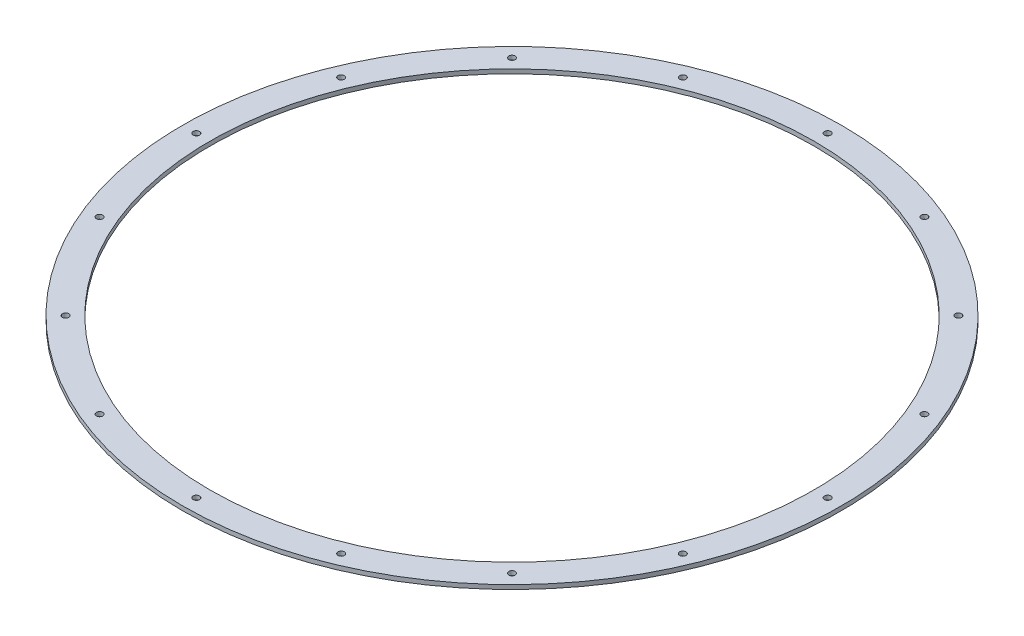
ISO-10303-21;
HEADER;
FILE_DESCRIPTION(('STEP AP214'),'2;1');
FILE_NAME('part.step','',(''),(''),'','','');
FILE_SCHEMA(('AUTOMOTIVE_DESIGN { 1 0 10303 214 1 1 1 1 }'));
ENDSEC;
DATA;
#1=APPLICATION_CONTEXT('core data for automotive mechanical design processes');
#2=APPLICATION_PROTOCOL_DEFINITION('international standard','automotive_design',2000,#1);
#3=PRODUCT_CONTEXT('',#1,'mechanical');
#4=PRODUCT('Part','Part','',(#3));
#5=PRODUCT_RELATED_PRODUCT_CATEGORY('part','',(#4));
#6=PRODUCT_DEFINITION_FORMATION('','',#4);
#7=PRODUCT_DEFINITION_CONTEXT('part definition',#1,'design');
#8=PRODUCT_DEFINITION('design','',#6,#7);
#9=PRODUCT_DEFINITION_SHAPE('','',#8);
#10=(LENGTH_UNIT() NAMED_UNIT(*) SI_UNIT(.MILLI.,.METRE.));
#11=(NAMED_UNIT(*) PLANE_ANGLE_UNIT() SI_UNIT($,.RADIAN.));
#12=(NAMED_UNIT(*) SI_UNIT($,.STERADIAN.) SOLID_ANGLE_UNIT());
#13=UNCERTAINTY_MEASURE_WITH_UNIT(LENGTH_MEASURE(1.E-05),#10,'distance_accuracy_value','');
#14=(GEOMETRIC_REPRESENTATION_CONTEXT(3) GLOBAL_UNCERTAINTY_ASSIGNED_CONTEXT((#13)) GLOBAL_UNIT_ASSIGNED_CONTEXT((#10,
#11,#12)) REPRESENTATION_CONTEXT('',''));
#15=CARTESIAN_POINT('',(0.,0.,0.));
#16=DIRECTION('',(0.,0.,1.));
#17=DIRECTION('',(1.,0.,0.));
#18=AXIS2_PLACEMENT_3D('',#15,#16,#17);
#19=CARTESIAN_POINT('',(0.,6.00000000000001,0.));
#20=DIRECTION('',(0.,1.,0.));
#21=DIRECTION('',(0.,0.,0.999999999999999));
#22=AXIS2_PLACEMENT_3D('',#19,#20,#21);
#23=PLANE('',#22);
#24=CARTESIAN_POINT('',(-312.894750675048,6.00000000000001,-312.894750675046));
#25=DIRECTION('',(0.,1.,0.));
#26=DIRECTION('',(0.707106781186548,0.,0.707106781186546));
#27=AXIS2_PLACEMENT_3D('',#24,#25,#26);
#28=CIRCLE('',#27,4.5);
#29=CARTESIAN_POINT('',(-309.712770159708,6.00000000000001,-309.712770159707));
#30=VERTEX_POINT('',#29);
#31=EDGE_CURVE('E128',#30,#30,#28,.T.);
#32=ORIENTED_EDGE('',*,*,#31,.F.);
#33=EDGE_LOOP('',(#32));
#34=FACE_BOUND('',#33,.T.);
#35=CARTESIAN_POINT('',(-408.816693136244,6.00000000000001,-169.337418821551));
#36=DIRECTION('',(0.,1.,0.));
#37=DIRECTION('',(0.923879532511287,0.,0.382683432365087));
#38=AXIS2_PLACEMENT_3D('',#35,#36,#37);
#39=CIRCLE('',#38,4.5);
#40=CARTESIAN_POINT('',(-404.659235239943,6.00000000000001,-167.615343375908));
#41=VERTEX_POINT('',#40);
#42=EDGE_CURVE('E120',#41,#41,#39,.T.);
#43=ORIENTED_EDGE('',*,*,#42,.F.);
#44=EDGE_LOOP('',(#43));
#45=FACE_BOUND('',#44,.T.);
#46=CARTESIAN_POINT('',(-442.499999999999,6.00000000000001,1.59594559789866E-12));
#47=DIRECTION('',(0.,1.,0.));
#48=DIRECTION('',(0.999999999999999,0.,0.));
#49=AXIS2_PLACEMENT_3D('',#46,#47,#48);
#50=CIRCLE('',#49,4.5);
#51=CARTESIAN_POINT('',(-437.999999999999,6.00000000000001,1.58023393187387E-12));
#52=VERTEX_POINT('',#51);
#53=EDGE_CURVE('E112',#52,#52,#50,.T.);
#54=ORIENTED_EDGE('',*,*,#53,.F.);
#55=EDGE_LOOP('',(#54));
#56=FACE_BOUND('',#55,.T.);
#57=CARTESIAN_POINT('',(-408.816693136243,6.00000000000001,169.337418821554));
#58=DIRECTION('',(0.,1.,0.));
#59=DIRECTION('',(0.923879532511285,0.,-0.382683432365094));
#60=AXIS2_PLACEMENT_3D('',#57,#58,#59);
#61=CIRCLE('',#60,4.5);
#62=CARTESIAN_POINT('',(-404.659235239942,6.00000000000001,167.615343375911));
#63=VERTEX_POINT('',#62);
#64=EDGE_CURVE('E104',#63,#63,#61,.T.);
#65=ORIENTED_EDGE('',*,*,#64,.F.);
#66=EDGE_LOOP('',(#65));
#67=FACE_BOUND('',#66,.T.);
#68=CARTESIAN_POINT('',(-312.894750675045,6.00000000000001,312.894750675049));
#69=DIRECTION('',(0.,1.,0.));
#70=DIRECTION('',(0.707106781186543,0.,-0.707106781186551));
#71=AXIS2_PLACEMENT_3D('',#68,#69,#70);
#72=CIRCLE('',#71,4.5);
#73=CARTESIAN_POINT('',(-309.712770159705,6.00000000000001,309.712770159709));
#74=VERTEX_POINT('',#73);
#75=EDGE_CURVE('E96',#74,#74,#72,.T.);
#76=ORIENTED_EDGE('',*,*,#75,.F.);
#77=EDGE_LOOP('',(#76));
#78=FACE_BOUND('',#77,.T.);
#79=CARTESIAN_POINT('',(-169.33741882155,6.00000000000001,408.816693136245));
#80=DIRECTION('',(0.,1.,0.));
#81=DIRECTION('',(0.382683432365084,0.,-0.923879532511288));
#82=AXIS2_PLACEMENT_3D('',#79,#80,#81);
#83=CIRCLE('',#82,4.5);
#84=CARTESIAN_POINT('',(-167.615343375907,6.00000000000001,404.659235239944));
#85=VERTEX_POINT('',#84);
#86=EDGE_CURVE('E88',#85,#85,#83,.T.);
#87=ORIENTED_EDGE('',*,*,#86,.F.);
#88=EDGE_LOOP('',(#87));
#89=FACE_BOUND('',#88,.T.);
#90=CARTESIAN_POINT('',(-2.22044604925031E-13,6.00000000000001,442.499999999999));
#91=DIRECTION('',(0.,1.,0.));
#92=DIRECTION('',(0.,0.,-0.999999999999999));
#93=AXIS2_PLACEMENT_3D('',#90,#91,#92);
#94=CIRCLE('',#93,4.5);
#95=CARTESIAN_POINT('',(-2.22044604925031E-13,6.00000000000001,437.999999999999));
#96=VERTEX_POINT('',#95);
#97=EDGE_CURVE('E78',#96,#96,#94,.T.);
#98=ORIENTED_EDGE('',*,*,#97,.F.);
#99=EDGE_LOOP('',(#98));
#100=FACE_BOUND('',#99,.T.);
#101=CARTESIAN_POINT('',(169.337418821555,6.00000000000001,408.816693136242));
#102=DIRECTION('',(0.,1.,0.));
#103=DIRECTION('',(-0.382683432365097,0.,-0.923879532511283));
#104=AXIS2_PLACEMENT_3D('',#101,#102,#103);
#105=CIRCLE('',#104,4.5);
#106=CARTESIAN_POINT('',(167.615343375912,6.00000000000001,404.659235239942));
#107=VERTEX_POINT('',#106);
#108=EDGE_CURVE('E79',#107,#107,#105,.T.);
#109=ORIENTED_EDGE('',*,*,#108,.F.);
#110=EDGE_LOOP('',(#109));
#111=FACE_BOUND('',#110,.T.);
#112=CARTESIAN_POINT('',(312.89475067505,6.00000000000001,312.894750675044));
#113=DIRECTION('',(0.,1.,0.));
#114=DIRECTION('',(-0.707106781186553,0.,-0.707106781186541));
#115=AXIS2_PLACEMENT_3D('',#112,#113,#114);
#116=CIRCLE('',#115,4.5);
#117=CARTESIAN_POINT('',(309.71277015971,6.00000000000001,309.712770159705));
#118=VERTEX_POINT('',#117);
#119=EDGE_CURVE('E175',#118,#118,#116,.T.);
#120=ORIENTED_EDGE('',*,*,#119,.F.);
#121=EDGE_LOOP('',(#120));
#122=FACE_BOUND('',#121,.T.);
#123=CARTESIAN_POINT('',(408.816693136246,6.00000000000001,169.337418821548));
#124=DIRECTION('',(0.,1.,0.));
#125=DIRECTION('',(-0.92387953251129,0.,-0.38268343236508));
#126=AXIS2_PLACEMENT_3D('',#123,#124,#125);
#127=CIRCLE('',#126,4.5);
#128=CARTESIAN_POINT('',(404.659235239945,6.00000000000001,167.615343375905));
#129=VERTEX_POINT('',#128);
#130=EDGE_CURVE('E167',#129,#129,#127,.T.);
#131=ORIENTED_EDGE('',*,*,#130,.F.);
#132=EDGE_LOOP('',(#131));
#133=FACE_BOUND('',#132,.T.);
#134=CARTESIAN_POINT('',(442.5,6.00000000000001,-4.69069227904129E-12));
#135=DIRECTION('',(0.,1.,0.));
#136=DIRECTION('',(-0.999999999999999,0.,0.));
#137=AXIS2_PLACEMENT_3D('',#134,#135,#136);
#138=CIRCLE('',#137,4.5);
#139=CARTESIAN_POINT('',(438.,6.00000000000001,-4.6435572809669E-12));
#140=VERTEX_POINT('',#139);
#141=EDGE_CURVE('E159',#140,#140,#138,.T.);
#142=ORIENTED_EDGE('',*,*,#141,.F.);
#143=EDGE_LOOP('',(#142));
#144=FACE_BOUND('',#143,.T.);
#145=CARTESIAN_POINT('',(408.816693136242,6.00000000000001,-169.337418821557));
#146=DIRECTION('',(0.,1.,0.));
#147=DIRECTION('',(-0.923879532511282,0.,0.382683432365099));
#148=AXIS2_PLACEMENT_3D('',#145,#146,#147);
#149=CIRCLE('',#148,4.5);
#150=CARTESIAN_POINT('',(404.659235239941,6.00000000000001,-167.615343375914));
#151=VERTEX_POINT('',#150);
#152=EDGE_CURVE('E151',#151,#151,#149,.T.);
#153=ORIENTED_EDGE('',*,*,#152,.F.);
#154=EDGE_LOOP('',(#153));
#155=FACE_BOUND('',#154,.T.);
#156=CARTESIAN_POINT('',(312.894750675043,6.00000000000001,-312.894750675051));
#157=DIRECTION('',(0.,1.,0.));
#158=DIRECTION('',(-0.707106781186538,0.,0.707106781186555));
#159=AXIS2_PLACEMENT_3D('',#156,#157,#158);
#160=CIRCLE('',#159,4.5);
#161=CARTESIAN_POINT('',(309.712770159703,6.00000000000001,-309.712770159711));
#162=VERTEX_POINT('',#161);
#163=EDGE_CURVE('E142',#162,#162,#160,.T.);
#164=ORIENTED_EDGE('',*,*,#163,.F.);
#165=EDGE_LOOP('',(#164));
#166=FACE_BOUND('',#165,.T.);
#167=CARTESIAN_POINT('',(169.337418821546,6.00000000000001,-408.816693136246));
#168=DIRECTION('',(0.,1.,0.));
#169=DIRECTION('',(-0.382683432365077,0.,0.923879532511291));
#170=AXIS2_PLACEMENT_3D('',#167,#168,#169);
#171=CIRCLE('',#170,4.5);
#172=CARTESIAN_POINT('',(167.615343375903,6.00000000000001,-404.659235239945));
#173=VERTEX_POINT('',#172);
#174=EDGE_CURVE('E143',#173,#173,#171,.T.);
#175=ORIENTED_EDGE('',*,*,#174,.F.);
#176=EDGE_LOOP('',(#175));
#177=FACE_BOUND('',#176,.T.);
#178=CARTESIAN_POINT('',(-169.337418821553,6.00000000000001,-408.816693136244));
#179=DIRECTION('',(0.,1.,0.));
#180=DIRECTION('',(0.38268343236509,0.,0.923879532511286));
#181=AXIS2_PLACEMENT_3D('',#178,#179,#180);
#182=CIRCLE('',#181,4.5);
#183=CARTESIAN_POINT('',(-167.61534337591,6.00000000000001,-404.659235239943));
#184=VERTEX_POINT('',#183);
#185=EDGE_CURVE('E69',#184,#184,#182,.T.);
#186=ORIENTED_EDGE('',*,*,#185,.F.);
#187=EDGE_LOOP('',(#186));
#188=FACE_BOUND('',#187,.T.);
#189=CARTESIAN_POINT('',(-1.11022302462516E-13,6.00000000000001,-442.499999999999));
#190=DIRECTION('',(0.,1.,0.));
#191=DIRECTION('',(0.,0.,0.999999999999999));
#192=AXIS2_PLACEMENT_3D('',#189,#190,#191);
#193=CIRCLE('',#192,4.5);
#194=CARTESIAN_POINT('',(-1.11022302462516E-13,6.00000000000001,-437.999999999999));
#195=VERTEX_POINT('',#194);
#196=EDGE_CURVE('E61',#195,#195,#193,.T.);
#197=ORIENTED_EDGE('',*,*,#196,.F.);
#198=EDGE_LOOP('',(#197));
#199=FACE_BOUND('',#198,.T.);
#200=CARTESIAN_POINT('',(0.,6.00000000000001,0.));
#201=DIRECTION('',(0.,1.,0.));
#202=DIRECTION('',(0.,0.,0.999999999999999));
#203=AXIS2_PLACEMENT_3D('',#200,#201,#202);
#204=CIRCLE('',#203,462.);
#205=CARTESIAN_POINT('',(0.,6.00000000000001,462.));
#206=VERTEX_POINT('',#205);
#207=EDGE_CURVE('E10',#206,#206,#204,.T.);
#208=ORIENTED_EDGE('',*,*,#207,.T.);
#209=EDGE_LOOP('',(#208));
#210=FACE_BOUND('',#209,.T.);
#211=CARTESIAN_POINT('',(0.,6.00000000000001,0.));
#212=DIRECTION('',(0.,1.,0.));
#213=DIRECTION('',(0.,0.,0.999999999999999));
#214=AXIS2_PLACEMENT_3D('',#211,#212,#213);
#215=CIRCLE('',#214,423.5);
#216=CARTESIAN_POINT('',(0.,6.00000000000001,423.5));
#217=VERTEX_POINT('',#216);
#218=EDGE_CURVE('E52',#217,#217,#215,.T.);
#219=ORIENTED_EDGE('',*,*,#218,.F.);
#220=EDGE_LOOP('',(#219));
#221=FACE_BOUND('',#220,.T.);
#222=ADVANCED_FACE('F36',(#34,#45,#56,#67,#78,#89,#100,#111,#122,#133,#144,#155,#166,#177,#188,
#199,#210,#221),#23,.T.);
#223=CARTESIAN_POINT('',(0.,0.,0.));
#224=DIRECTION('',(0.,1.,0.));
#225=DIRECTION('',(0.,0.,0.999999999999999));
#226=AXIS2_PLACEMENT_3D('',#223,#224,#225);
#227=PLANE('',#226);
#228=CARTESIAN_POINT('',(-312.894750675048,0.,-312.894750675046));
#229=DIRECTION('',(0.,1.,0.));
#230=DIRECTION('',(0.707106781186548,0.,0.707106781186546));
#231=AXIS2_PLACEMENT_3D('',#228,#229,#230);
#232=CIRCLE('',#231,4.5);
#233=CARTESIAN_POINT('',(-309.712770159708,0.,-309.712770159707));
#234=VERTEX_POINT('',#233);
#235=EDGE_CURVE('E73',#234,#234,#232,.T.);
#236=ORIENTED_EDGE('',*,*,#235,.T.);
#237=EDGE_LOOP('',(#236));
#238=FACE_BOUND('',#237,.T.);
#239=CARTESIAN_POINT('',(-408.816693136244,0.,-169.337418821551));
#240=DIRECTION('',(0.,1.,0.));
#241=DIRECTION('',(0.923879532511287,0.,0.382683432365087));
#242=AXIS2_PLACEMENT_3D('',#239,#240,#241);
#243=CIRCLE('',#242,4.5);
#244=CARTESIAN_POINT('',(-404.659235239943,0.,-167.615343375908));
#245=VERTEX_POINT('',#244);
#246=EDGE_CURVE('E124',#245,#245,#243,.T.);
#247=ORIENTED_EDGE('',*,*,#246,.T.);
#248=EDGE_LOOP('',(#247));
#249=FACE_BOUND('',#248,.T.);
#250=CARTESIAN_POINT('',(-442.499999999999,0.,1.59594559789866E-12));
#251=DIRECTION('',(0.,1.,0.));
#252=DIRECTION('',(0.999999999999999,0.,0.));
#253=AXIS2_PLACEMENT_3D('',#250,#251,#252);
#254=CIRCLE('',#253,4.5);
#255=CARTESIAN_POINT('',(-437.999999999999,0.,1.58023393187387E-12));
#256=VERTEX_POINT('',#255);
#257=EDGE_CURVE('E116',#256,#256,#254,.T.);
#258=ORIENTED_EDGE('',*,*,#257,.T.);
#259=EDGE_LOOP('',(#258));
#260=FACE_BOUND('',#259,.T.);
#261=CARTESIAN_POINT('',(-408.816693136243,0.,169.337418821554));
#262=DIRECTION('',(0.,1.,0.));
#263=DIRECTION('',(0.923879532511285,0.,-0.382683432365094));
#264=AXIS2_PLACEMENT_3D('',#261,#262,#263);
#265=CIRCLE('',#264,4.5);
#266=CARTESIAN_POINT('',(-404.659235239942,0.,167.615343375911));
#267=VERTEX_POINT('',#266);
#268=EDGE_CURVE('E108',#267,#267,#265,.T.);
#269=ORIENTED_EDGE('',*,*,#268,.T.);
#270=EDGE_LOOP('',(#269));
#271=FACE_BOUND('',#270,.T.);
#272=CARTESIAN_POINT('',(-312.894750675045,0.,312.894750675049));
#273=DIRECTION('',(0.,1.,0.));
#274=DIRECTION('',(0.707106781186543,0.,-0.707106781186551));
#275=AXIS2_PLACEMENT_3D('',#272,#273,#274);
#276=CIRCLE('',#275,4.5);
#277=CARTESIAN_POINT('',(-309.712770159705,0.,309.712770159709));
#278=VERTEX_POINT('',#277);
#279=EDGE_CURVE('E100',#278,#278,#276,.T.);
#280=ORIENTED_EDGE('',*,*,#279,.T.);
#281=EDGE_LOOP('',(#280));
#282=FACE_BOUND('',#281,.T.);
#283=CARTESIAN_POINT('',(-169.33741882155,0.,408.816693136245));
#284=DIRECTION('',(0.,1.,0.));
#285=DIRECTION('',(0.382683432365084,0.,-0.923879532511288));
#286=AXIS2_PLACEMENT_3D('',#283,#284,#285);
#287=CIRCLE('',#286,4.5);
#288=CARTESIAN_POINT('',(-167.615343375907,0.,404.659235239944));
#289=VERTEX_POINT('',#288);
#290=EDGE_CURVE('E92',#289,#289,#287,.T.);
#291=ORIENTED_EDGE('',*,*,#290,.T.);
#292=EDGE_LOOP('',(#291));
#293=FACE_BOUND('',#292,.T.);
#294=CARTESIAN_POINT('',(-2.22044604925031E-13,0.,442.499999999999));
#295=DIRECTION('',(0.,1.,0.));
#296=DIRECTION('',(0.,0.,-0.999999999999999));
#297=AXIS2_PLACEMENT_3D('',#294,#295,#296);
#298=CIRCLE('',#297,4.5);
#299=CARTESIAN_POINT('',(-2.22044604925031E-13,0.,437.999999999999));
#300=VERTEX_POINT('',#299);
#301=EDGE_CURVE('E84',#300,#300,#298,.T.);
#302=ORIENTED_EDGE('',*,*,#301,.T.);
#303=EDGE_LOOP('',(#302));
#304=FACE_BOUND('',#303,.T.);
#305=CARTESIAN_POINT('',(169.337418821555,0.,408.816693136242));
#306=DIRECTION('',(0.,1.,0.));
#307=DIRECTION('',(-0.382683432365097,0.,-0.923879532511283));
#308=AXIS2_PLACEMENT_3D('',#305,#306,#307);
#309=CIRCLE('',#308,4.5);
#310=CARTESIAN_POINT('',(167.615343375912,0.,404.659235239942));
#311=VERTEX_POINT('',#310);
#312=EDGE_CURVE('E74',#311,#311,#309,.T.);
#313=ORIENTED_EDGE('',*,*,#312,.T.);
#314=EDGE_LOOP('',(#313));
#315=FACE_BOUND('',#314,.T.);
#316=CARTESIAN_POINT('',(312.89475067505,0.,312.894750675044));
#317=DIRECTION('',(0.,1.,0.));
#318=DIRECTION('',(-0.707106781186553,0.,-0.707106781186541));
#319=AXIS2_PLACEMENT_3D('',#316,#317,#318);
#320=CIRCLE('',#319,4.5);
#321=CARTESIAN_POINT('',(309.71277015971,0.,309.712770159705));
#322=VERTEX_POINT('',#321);
#323=EDGE_CURVE('E83',#322,#322,#320,.T.);
#324=ORIENTED_EDGE('',*,*,#323,.T.);
#325=EDGE_LOOP('',(#324));
#326=FACE_BOUND('',#325,.T.);
#327=CARTESIAN_POINT('',(408.816693136246,0.,169.337418821548));
#328=DIRECTION('',(0.,1.,0.));
#329=DIRECTION('',(-0.92387953251129,0.,-0.38268343236508));
#330=AXIS2_PLACEMENT_3D('',#327,#328,#329);
#331=CIRCLE('',#330,4.5);
#332=CARTESIAN_POINT('',(404.659235239945,0.,167.615343375905));
#333=VERTEX_POINT('',#332);
#334=EDGE_CURVE('E171',#333,#333,#331,.T.);
#335=ORIENTED_EDGE('',*,*,#334,.T.);
#336=EDGE_LOOP('',(#335));
#337=FACE_BOUND('',#336,.T.);
#338=CARTESIAN_POINT('',(442.5,0.,-4.69069227904129E-12));
#339=DIRECTION('',(0.,1.,0.));
#340=DIRECTION('',(-0.999999999999999,0.,0.));
#341=AXIS2_PLACEMENT_3D('',#338,#339,#340);
#342=CIRCLE('',#341,4.5);
#343=CARTESIAN_POINT('',(438.,0.,-4.6435572809669E-12));
#344=VERTEX_POINT('',#343);
#345=EDGE_CURVE('E163',#344,#344,#342,.T.);
#346=ORIENTED_EDGE('',*,*,#345,.T.);
#347=EDGE_LOOP('',(#346));
#348=FACE_BOUND('',#347,.T.);
#349=CARTESIAN_POINT('',(408.816693136242,0.,-169.337418821557));
#350=DIRECTION('',(0.,1.,0.));
#351=DIRECTION('',(-0.923879532511282,0.,0.382683432365099));
#352=AXIS2_PLACEMENT_3D('',#349,#350,#351);
#353=CIRCLE('',#352,4.5);
#354=CARTESIAN_POINT('',(404.659235239941,0.,-167.615343375914));
#355=VERTEX_POINT('',#354);
#356=EDGE_CURVE('E155',#355,#355,#353,.T.);
#357=ORIENTED_EDGE('',*,*,#356,.T.);
#358=EDGE_LOOP('',(#357));
#359=FACE_BOUND('',#358,.T.);
#360=CARTESIAN_POINT('',(312.894750675043,0.,-312.894750675051));
#361=DIRECTION('',(0.,1.,0.));
#362=DIRECTION('',(-0.707106781186538,0.,0.707106781186555));
#363=AXIS2_PLACEMENT_3D('',#360,#361,#362);
#364=CIRCLE('',#363,4.5);
#365=CARTESIAN_POINT('',(309.712770159703,0.,-309.712770159711));
#366=VERTEX_POINT('',#365);
#367=EDGE_CURVE('E147',#366,#366,#364,.T.);
#368=ORIENTED_EDGE('',*,*,#367,.T.);
#369=EDGE_LOOP('',(#368));
#370=FACE_BOUND('',#369,.T.);
#371=CARTESIAN_POINT('',(169.337418821546,0.,-408.816693136246));
#372=DIRECTION('',(0.,1.,0.));
#373=DIRECTION('',(-0.382683432365077,0.,0.923879532511291));
#374=AXIS2_PLACEMENT_3D('',#371,#372,#373);
#375=CIRCLE('',#374,4.5);
#376=CARTESIAN_POINT('',(167.615343375903,0.,-404.659235239945));
#377=VERTEX_POINT('',#376);
#378=EDGE_CURVE('E138',#377,#377,#375,.T.);
#379=ORIENTED_EDGE('',*,*,#378,.T.);
#380=EDGE_LOOP('',(#379));
#381=FACE_BOUND('',#380,.T.);
#382=CARTESIAN_POINT('',(-169.337418821553,0.,-408.816693136244));
#383=DIRECTION('',(0.,1.,0.));
#384=DIRECTION('',(0.38268343236509,0.,0.923879532511286));
#385=AXIS2_PLACEMENT_3D('',#382,#383,#384);
#386=CIRCLE('',#385,4.5);
#387=CARTESIAN_POINT('',(-167.61534337591,0.,-404.659235239943));
#388=VERTEX_POINT('',#387);
#389=EDGE_CURVE('E65',#388,#388,#386,.T.);
#390=ORIENTED_EDGE('',*,*,#389,.T.);
#391=EDGE_LOOP('',(#390));
#392=FACE_BOUND('',#391,.T.);
#393=CARTESIAN_POINT('',(-1.11022302462516E-13,0.,-442.499999999999));
#394=DIRECTION('',(0.,1.,0.));
#395=DIRECTION('',(0.,0.,0.999999999999999));
#396=AXIS2_PLACEMENT_3D('',#393,#394,#395);
#397=CIRCLE('',#396,4.5);
#398=CARTESIAN_POINT('',(-1.11022302462516E-13,0.,-437.999999999999));
#399=VERTEX_POINT('',#398);
#400=EDGE_CURVE('E40',#399,#399,#397,.T.);
#401=ORIENTED_EDGE('',*,*,#400,.T.);
#402=EDGE_LOOP('',(#401));
#403=FACE_BOUND('',#402,.T.);
#404=CARTESIAN_POINT('',(0.,0.,0.));
#405=DIRECTION('',(0.,1.,0.));
#406=DIRECTION('',(0.,0.,0.999999999999999));
#407=AXIS2_PLACEMENT_3D('',#404,#405,#406);
#408=CIRCLE('',#407,462.);
#409=CARTESIAN_POINT('',(0.,0.,462.));
#410=VERTEX_POINT('',#409);
#411=EDGE_CURVE('E45',#410,#410,#408,.T.);
#412=ORIENTED_EDGE('',*,*,#411,.F.);
#413=EDGE_LOOP('',(#412));
#414=FACE_BOUND('',#413,.T.);
#415=CARTESIAN_POINT('',(0.,0.,0.));
#416=DIRECTION('',(0.,1.,0.));
#417=DIRECTION('',(0.,0.,0.999999999999999));
#418=AXIS2_PLACEMENT_3D('',#415,#416,#417);
#419=CIRCLE('',#418,423.5);
#420=CARTESIAN_POINT('',(0.,0.,423.5));
#421=VERTEX_POINT('',#420);
#422=EDGE_CURVE('E54',#421,#421,#419,.T.);
#423=ORIENTED_EDGE('',*,*,#422,.T.);
#424=EDGE_LOOP('',(#423));
#425=FACE_BOUND('',#424,.T.);
#426=ADVANCED_FACE('F192',(#238,#249,#260,#271,#282,#293,#304,#315,#326,#337,#348,#359,#370,
#381,#392,#403,#414,#425),#227,.F.);
#427=CARTESIAN_POINT('',(0.,6.00000000000001,0.));
#428=DIRECTION('',(0.,-1.,0.));
#429=DIRECTION('',(0.,0.,-0.999999999999999));
#430=AXIS2_PLACEMENT_3D('',#427,#428,#429);
#431=CYLINDRICAL_SURFACE('',#430,462.);
#432=ORIENTED_EDGE('',*,*,#207,.F.);
#433=EDGE_LOOP('',(#432));
#434=FACE_BOUND('',#433,.T.);
#435=ORIENTED_EDGE('',*,*,#411,.T.);
#436=EDGE_LOOP('',(#435));
#437=FACE_BOUND('',#436,.T.);
#438=ADVANCED_FACE('F38',(#434,#437),#431,.T.);
#439=CARTESIAN_POINT('',(0.,6.00000000000001,0.));
#440=DIRECTION('',(0.,-1.,0.));
#441=DIRECTION('',(0.,0.,-0.999999999999999));
#442=AXIS2_PLACEMENT_3D('',#439,#440,#441);
#443=CYLINDRICAL_SURFACE('',#442,423.5);
#444=ORIENTED_EDGE('',*,*,#218,.T.);
#445=EDGE_LOOP('',(#444));
#446=FACE_BOUND('',#445,.T.);
#447=ORIENTED_EDGE('',*,*,#422,.F.);
#448=EDGE_LOOP('',(#447));
#449=FACE_BOUND('',#448,.T.);
#450=ADVANCED_FACE('F211',(#446,#449),#443,.F.);
#451=CARTESIAN_POINT('',(-1.11022302462516E-13,-40.,-442.499999999999));
#452=DIRECTION('',(0.,1.,0.));
#453=DIRECTION('',(0.,0.,0.999999999999999));
#454=AXIS2_PLACEMENT_3D('',#451,#452,#453);
#455=CYLINDRICAL_SURFACE('',#454,4.5);
#456=ORIENTED_EDGE('',*,*,#196,.T.);
#457=EDGE_LOOP('',(#456));
#458=FACE_BOUND('',#457,.T.);
#459=ORIENTED_EDGE('',*,*,#400,.F.);
#460=EDGE_LOOP('',(#459));
#461=FACE_BOUND('',#460,.T.);
#462=ADVANCED_FACE('F214',(#458,#461),#455,.F.);
#463=CARTESIAN_POINT('',(-169.337418821553,-40.,-408.816693136244));
#464=DIRECTION('',(0.,1.,0.));
#465=DIRECTION('',(0.38268343236509,0.,0.923879532511286));
#466=AXIS2_PLACEMENT_3D('',#463,#464,#465);
#467=CYLINDRICAL_SURFACE('',#466,4.5);
#468=ORIENTED_EDGE('',*,*,#185,.T.);
#469=EDGE_LOOP('',(#468));
#470=FACE_BOUND('',#469,.T.);
#471=ORIENTED_EDGE('',*,*,#389,.F.);
#472=EDGE_LOOP('',(#471));
#473=FACE_BOUND('',#472,.T.);
#474=ADVANCED_FACE('F228',(#470,#473),#467,.F.);
#475=CARTESIAN_POINT('',(169.337418821546,-40.,-408.816693136246));
#476=DIRECTION('',(0.,1.,0.));
#477=DIRECTION('',(-0.382683432365077,0.,0.923879532511291));
#478=AXIS2_PLACEMENT_3D('',#475,#476,#477);
#479=CYLINDRICAL_SURFACE('',#478,4.5);
#480=ORIENTED_EDGE('',*,*,#174,.T.);
#481=EDGE_LOOP('',(#480));
#482=FACE_BOUND('',#481,.T.);
#483=ORIENTED_EDGE('',*,*,#378,.F.);
#484=EDGE_LOOP('',(#483));
#485=FACE_BOUND('',#484,.T.);
#486=ADVANCED_FACE('F232',(#482,#485),#479,.F.);
#487=CARTESIAN_POINT('',(312.894750675043,-40.,-312.894750675051));
#488=DIRECTION('',(0.,1.,0.));
#489=DIRECTION('',(-0.707106781186538,0.,0.707106781186555));
#490=AXIS2_PLACEMENT_3D('',#487,#488,#489);
#491=CYLINDRICAL_SURFACE('',#490,4.5);
#492=ORIENTED_EDGE('',*,*,#163,.T.);
#493=EDGE_LOOP('',(#492));
#494=FACE_BOUND('',#493,.T.);
#495=ORIENTED_EDGE('',*,*,#367,.F.);
#496=EDGE_LOOP('',(#495));
#497=FACE_BOUND('',#496,.T.);
#498=ADVANCED_FACE('F268',(#494,#497),#491,.F.);
#499=CARTESIAN_POINT('',(408.816693136242,-40.,-169.337418821557));
#500=DIRECTION('',(0.,1.,0.));
#501=DIRECTION('',(-0.923879532511282,0.,0.382683432365099));
#502=AXIS2_PLACEMENT_3D('',#499,#500,#501);
#503=CYLINDRICAL_SURFACE('',#502,4.5);
#504=ORIENTED_EDGE('',*,*,#152,.T.);
#505=EDGE_LOOP('',(#504));
#506=FACE_BOUND('',#505,.T.);
#507=ORIENTED_EDGE('',*,*,#356,.F.);
#508=EDGE_LOOP('',(#507));
#509=FACE_BOUND('',#508,.T.);
#510=ADVANCED_FACE('F272',(#506,#509),#503,.F.);
#511=CARTESIAN_POINT('',(442.5,-40.,-4.69069227904129E-12));
#512=DIRECTION('',(0.,1.,0.));
#513=DIRECTION('',(-0.999999999999999,0.,0.));
#514=AXIS2_PLACEMENT_3D('',#511,#512,#513);
#515=CYLINDRICAL_SURFACE('',#514,4.5);
#516=ORIENTED_EDGE('',*,*,#141,.T.);
#517=EDGE_LOOP('',(#516));
#518=FACE_BOUND('',#517,.T.);
#519=ORIENTED_EDGE('',*,*,#345,.F.);
#520=EDGE_LOOP('',(#519));
#521=FACE_BOUND('',#520,.T.);
#522=ADVANCED_FACE('F276',(#518,#521),#515,.F.);
#523=CARTESIAN_POINT('',(408.816693136246,-40.,169.337418821548));
#524=DIRECTION('',(0.,1.,0.));
#525=DIRECTION('',(-0.92387953251129,0.,-0.38268343236508));
#526=AXIS2_PLACEMENT_3D('',#523,#524,#525);
#527=CYLINDRICAL_SURFACE('',#526,4.5);
#528=ORIENTED_EDGE('',*,*,#130,.T.);
#529=EDGE_LOOP('',(#528));
#530=FACE_BOUND('',#529,.T.);
#531=ORIENTED_EDGE('',*,*,#334,.F.);
#532=EDGE_LOOP('',(#531));
#533=FACE_BOUND('',#532,.T.);
#534=ADVANCED_FACE('F280',(#530,#533),#527,.F.);
#535=CARTESIAN_POINT('',(312.89475067505,-40.,312.894750675044));
#536=DIRECTION('',(0.,1.,0.));
#537=DIRECTION('',(-0.707106781186553,0.,-0.707106781186541));
#538=AXIS2_PLACEMENT_3D('',#535,#536,#537);
#539=CYLINDRICAL_SURFACE('',#538,4.5);
#540=ORIENTED_EDGE('',*,*,#119,.T.);
#541=EDGE_LOOP('',(#540));
#542=FACE_BOUND('',#541,.T.);
#543=ORIENTED_EDGE('',*,*,#323,.F.);
#544=EDGE_LOOP('',(#543));
#545=FACE_BOUND('',#544,.T.);
#546=ADVANCED_FACE('F187',(#542,#545),#539,.F.);
#547=CARTESIAN_POINT('',(169.337418821555,-40.,408.816693136242));
#548=DIRECTION('',(0.,1.,0.));
#549=DIRECTION('',(-0.382683432365097,0.,-0.923879532511283));
#550=AXIS2_PLACEMENT_3D('',#547,#548,#549);
#551=CYLINDRICAL_SURFACE('',#550,4.5);
#552=ORIENTED_EDGE('',*,*,#108,.T.);
#553=EDGE_LOOP('',(#552));
#554=FACE_BOUND('',#553,.T.);
#555=ORIENTED_EDGE('',*,*,#312,.F.);
#556=EDGE_LOOP('',(#555));
#557=FACE_BOUND('',#556,.T.);
#558=ADVANCED_FACE('F234',(#554,#557),#551,.F.);
#559=CARTESIAN_POINT('',(-2.22044604925031E-13,-40.,442.499999999999));
#560=DIRECTION('',(0.,1.,0.));
#561=DIRECTION('',(0.,0.,-0.999999999999999));
#562=AXIS2_PLACEMENT_3D('',#559,#560,#561);
#563=CYLINDRICAL_SURFACE('',#562,4.5);
#564=ORIENTED_EDGE('',*,*,#97,.T.);
#565=EDGE_LOOP('',(#564));
#566=FACE_BOUND('',#565,.T.);
#567=ORIENTED_EDGE('',*,*,#301,.F.);
#568=EDGE_LOOP('',(#567));
#569=FACE_BOUND('',#568,.T.);
#570=ADVANCED_FACE('F237',(#566,#569),#563,.F.);
#571=CARTESIAN_POINT('',(-169.33741882155,-40.,408.816693136245));
#572=DIRECTION('',(0.,1.,0.));
#573=DIRECTION('',(0.382683432365084,0.,-0.923879532511288));
#574=AXIS2_PLACEMENT_3D('',#571,#572,#573);
#575=CYLINDRICAL_SURFACE('',#574,4.5);
#576=ORIENTED_EDGE('',*,*,#86,.T.);
#577=EDGE_LOOP('',(#576));
#578=FACE_BOUND('',#577,.T.);
#579=ORIENTED_EDGE('',*,*,#290,.F.);
#580=EDGE_LOOP('',(#579));
#581=FACE_BOUND('',#580,.T.);
#582=ADVANCED_FACE('F241',(#578,#581),#575,.F.);
#583=CARTESIAN_POINT('',(-312.894750675045,-40.,312.894750675049));
#584=DIRECTION('',(0.,1.,0.));
#585=DIRECTION('',(0.707106781186543,0.,-0.707106781186551));
#586=AXIS2_PLACEMENT_3D('',#583,#584,#585);
#587=CYLINDRICAL_SURFACE('',#586,4.5);
#588=ORIENTED_EDGE('',*,*,#75,.T.);
#589=EDGE_LOOP('',(#588));
#590=FACE_BOUND('',#589,.T.);
#591=ORIENTED_EDGE('',*,*,#279,.F.);
#592=EDGE_LOOP('',(#591));
#593=FACE_BOUND('',#592,.T.);
#594=ADVANCED_FACE('F245',(#590,#593),#587,.F.);
#595=CARTESIAN_POINT('',(-408.816693136243,-40.,169.337418821554));
#596=DIRECTION('',(0.,1.,0.));
#597=DIRECTION('',(0.923879532511285,0.,-0.382683432365094));
#598=AXIS2_PLACEMENT_3D('',#595,#596,#597);
#599=CYLINDRICAL_SURFACE('',#598,4.5);
#600=ORIENTED_EDGE('',*,*,#64,.T.);
#601=EDGE_LOOP('',(#600));
#602=FACE_BOUND('',#601,.T.);
#603=ORIENTED_EDGE('',*,*,#268,.F.);
#604=EDGE_LOOP('',(#603));
#605=FACE_BOUND('',#604,.T.);
#606=ADVANCED_FACE('F249',(#602,#605),#599,.F.);
#607=CARTESIAN_POINT('',(-442.499999999999,-40.,1.59594559789866E-12));
#608=DIRECTION('',(0.,1.,0.));
#609=DIRECTION('',(0.999999999999999,0.,0.));
#610=AXIS2_PLACEMENT_3D('',#607,#608,#609);
#611=CYLINDRICAL_SURFACE('',#610,4.5);
#612=ORIENTED_EDGE('',*,*,#53,.T.);
#613=EDGE_LOOP('',(#612));
#614=FACE_BOUND('',#613,.T.);
#615=ORIENTED_EDGE('',*,*,#257,.F.);
#616=EDGE_LOOP('',(#615));
#617=FACE_BOUND('',#616,.T.);
#618=ADVANCED_FACE('F253',(#614,#617),#611,.F.);
#619=CARTESIAN_POINT('',(-408.816693136244,-40.,-169.337418821551));
#620=DIRECTION('',(0.,1.,0.));
#621=DIRECTION('',(0.923879532511287,0.,0.382683432365087));
#622=AXIS2_PLACEMENT_3D('',#619,#620,#621);
#623=CYLINDRICAL_SURFACE('',#622,4.5);
#624=ORIENTED_EDGE('',*,*,#42,.T.);
#625=EDGE_LOOP('',(#624));
#626=FACE_BOUND('',#625,.T.);
#627=ORIENTED_EDGE('',*,*,#246,.F.);
#628=EDGE_LOOP('',(#627));
#629=FACE_BOUND('',#628,.T.);
#630=ADVANCED_FACE('F257',(#626,#629),#623,.F.);
#631=CARTESIAN_POINT('',(-312.894750675048,-40.,-312.894750675046));
#632=DIRECTION('',(0.,1.,0.));
#633=DIRECTION('',(0.707106781186548,0.,0.707106781186546));
#634=AXIS2_PLACEMENT_3D('',#631,#632,#633);
#635=CYLINDRICAL_SURFACE('',#634,4.5);
#636=ORIENTED_EDGE('',*,*,#31,.T.);
#637=EDGE_LOOP('',(#636));
#638=FACE_BOUND('',#637,.T.);
#639=ORIENTED_EDGE('',*,*,#235,.F.);
#640=EDGE_LOOP('',(#639));
#641=FACE_BOUND('',#640,.T.);
#642=ADVANCED_FACE('F261',(#638,#641),#635,.F.);
#643=CLOSED_SHELL('',(#222,#426,#438,#450,#462,#474,#486,#498,#510,#522,#534,#546,#558,#570,
#582,#594,#606,#618,#630,#642));
#644=MANIFOLD_SOLID_BREP('B2',#643);
#645=ADVANCED_BREP_SHAPE_REPRESENTATION('',(#18,#644),#14);
#646=SHAPE_DEFINITION_REPRESENTATION(#9,#645);
ENDSEC;
END-ISO-10303-21;
